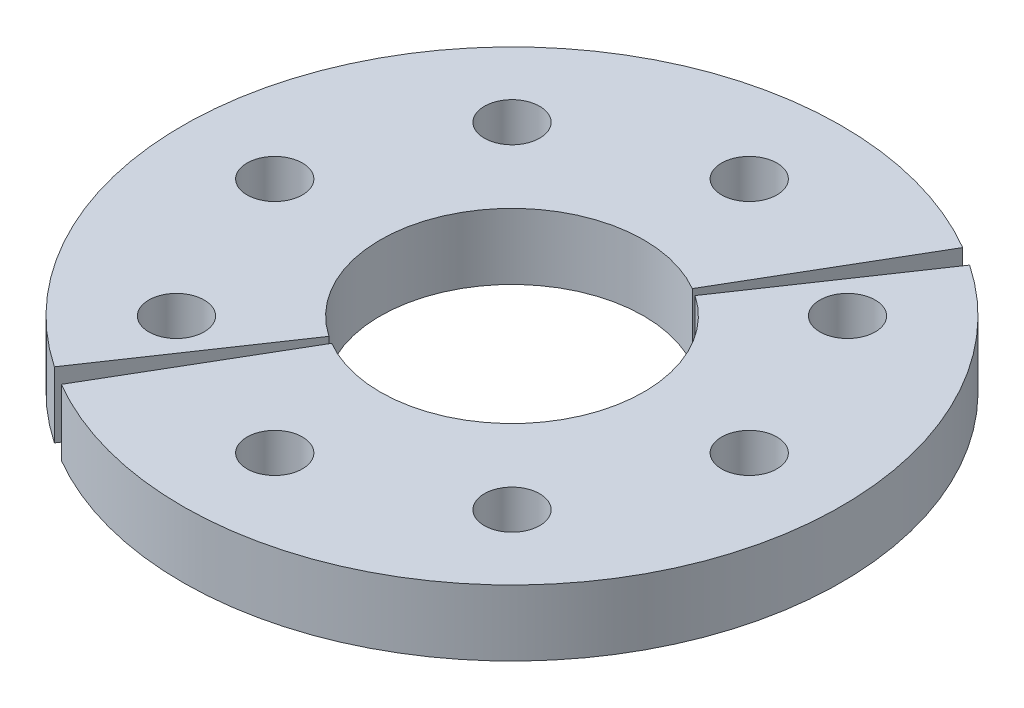
ISO-10303-21;
HEADER;
FILE_DESCRIPTION(('STEP AP214'),'2;1');
FILE_NAME('part.step','',(''),(''),'','','');
FILE_SCHEMA(('AUTOMOTIVE_DESIGN { 1 0 10303 214 1 1 1 1 }'));
ENDSEC;
DATA;
#1=APPLICATION_CONTEXT('core data for automotive mechanical design processes');
#2=APPLICATION_PROTOCOL_DEFINITION('international standard','automotive_design',2000,#1);
#3=PRODUCT_CONTEXT('',#1,'mechanical');
#4=PRODUCT('Part','Part','',(#3));
#5=PRODUCT_RELATED_PRODUCT_CATEGORY('part','',(#4));
#6=PRODUCT_DEFINITION_FORMATION('','',#4);
#7=PRODUCT_DEFINITION_CONTEXT('part definition',#1,'design');
#8=PRODUCT_DEFINITION('design','',#6,#7);
#9=PRODUCT_DEFINITION_SHAPE('','',#8);
#10=(LENGTH_UNIT() NAMED_UNIT(*) SI_UNIT(.MILLI.,.METRE.));
#11=(NAMED_UNIT(*) PLANE_ANGLE_UNIT() SI_UNIT($,.RADIAN.));
#12=(NAMED_UNIT(*) SI_UNIT($,.STERADIAN.) SOLID_ANGLE_UNIT());
#13=UNCERTAINTY_MEASURE_WITH_UNIT(LENGTH_MEASURE(1.E-05),#10,'distance_accuracy_value','');
#14=(GEOMETRIC_REPRESENTATION_CONTEXT(3) GLOBAL_UNCERTAINTY_ASSIGNED_CONTEXT((#13)) GLOBAL_UNIT_ASSIGNED_CONTEXT((#10,
#11,#12)) REPRESENTATION_CONTEXT('',''));
#15=CARTESIAN_POINT('',(0.,0.,0.));
#16=DIRECTION('',(0.,0.,1.));
#17=DIRECTION('',(1.,0.,0.));
#18=AXIS2_PLACEMENT_3D('',#15,#16,#17);
#19=CARTESIAN_POINT('',(0.,5.,0.));
#20=DIRECTION('',(0.863656991008905,0.,0.504079955841773));
#21=DIRECTION('',(0.504079955841773,0.,-0.863656991008905));
#22=AXIS2_PLACEMENT_3D('',#19,#20,#21);
#23=PLANE('',#22);
#24=DIRECTION('',(-0.504079955841773,0.,0.863656991008905));
#25=VECTOR('',#24,1.);
#26=CARTESIAN_POINT('',(0.,0.,0.));
#27=LINE('',#26,#25);
#28=CARTESIAN_POINT('',(-5.04079955841773,0.,8.63656991008905));
#29=VERTEX_POINT('',#28);
#30=CARTESIAN_POINT('',(-12.6019988960443,0.,21.5914247752226));
#31=VERTEX_POINT('',#30);
#32=EDGE_CURVE('E145',#29,#31,#27,.T.);
#33=ORIENTED_EDGE('',*,*,#32,.T.);
#34=DIRECTION('',(0.,-1.,0.));
#35=VECTOR('',#34,1.);
#36=CARTESIAN_POINT('',(-12.6019988960443,5.,21.5914247752226));
#37=LINE('',#36,#35);
#38=CARTESIAN_POINT('',(-12.6019988960443,5.,21.5914247752226));
#39=VERTEX_POINT('',#38);
#40=EDGE_CURVE('E13',#39,#31,#37,.T.);
#41=ORIENTED_EDGE('',*,*,#40,.F.);
#42=DIRECTION('',(-0.504079955841773,0.,0.863656991008905));
#43=VECTOR('',#42,1.);
#44=CARTESIAN_POINT('',(0.,5.,0.));
#45=LINE('',#44,#43);
#46=CARTESIAN_POINT('',(-5.04079955841773,5.,8.63656991008905));
#47=VERTEX_POINT('',#46);
#48=EDGE_CURVE('E119',#47,#39,#45,.T.);
#49=ORIENTED_EDGE('',*,*,#48,.F.);
#50=DIRECTION('',(0.,-1.,0.));
#51=VECTOR('',#50,1.);
#52=CARTESIAN_POINT('',(-5.04079955841773,5.,8.63656991008905));
#53=LINE('',#52,#51);
#54=EDGE_CURVE('E86',#47,#29,#53,.T.);
#55=ORIENTED_EDGE('',*,*,#54,.T.);
#56=EDGE_LOOP('',(#33,#41,#49,#55));
#57=FACE_BOUND('',#56,.T.);
#58=ADVANCED_FACE('F69',(#57),#23,.F.);
#59=CARTESIAN_POINT('',(0.,5.,0.));
#60=DIRECTION('',(0.,-1.,0.));
#61=DIRECTION('',(0.,0.,-1.));
#62=AXIS2_PLACEMENT_3D('',#59,#60,#61);
#63=CYLINDRICAL_SURFACE('',#62,25.);
#64=CARTESIAN_POINT('',(0.,0.,0.));
#65=DIRECTION('',(0.,1.,0.));
#66=DIRECTION('',(0.,0.,1.));
#67=AXIS2_PLACEMENT_3D('',#64,#65,#66);
#68=CIRCLE('',#67,25.);
#69=CARTESIAN_POINT('',(14.0158599127635,0.,-20.7015861929899));
#70=VERTEX_POINT('',#69);
#71=EDGE_CURVE('E124',#31,#70,#68,.T.);
#72=ORIENTED_EDGE('',*,*,#71,.T.);
#73=DIRECTION('',(0.,-1.,0.));
#74=VECTOR('',#73,1.);
#75=CARTESIAN_POINT('',(14.0158599127635,5.,-20.7015861929899));
#76=LINE('',#75,#74);
#77=CARTESIAN_POINT('',(14.0158599127635,5.,-20.7015861929899));
#78=VERTEX_POINT('',#77);
#79=EDGE_CURVE('E78',#78,#70,#76,.T.);
#80=ORIENTED_EDGE('',*,*,#79,.F.);
#81=CARTESIAN_POINT('',(0.,5.,0.));
#82=DIRECTION('',(0.,1.,0.));
#83=DIRECTION('',(0.,0.,1.));
#84=AXIS2_PLACEMENT_3D('',#81,#82,#83);
#85=CIRCLE('',#84,25.);
#86=EDGE_CURVE('E111',#39,#78,#85,.T.);
#87=ORIENTED_EDGE('',*,*,#86,.F.);
#88=ORIENTED_EDGE('',*,*,#40,.T.);
#89=EDGE_LOOP('',(#72,#80,#87,#88));
#90=FACE_BOUND('',#89,.T.);
#91=ADVANCED_FACE('F123',(#90),#63,.T.);
#92=CARTESIAN_POINT('',(0.,5.,0.));
#93=DIRECTION('',(-0.828063447719594,0.,-0.560634396510542));
#94=DIRECTION('',(-0.560634396510542,0.,0.828063447719594));
#95=AXIS2_PLACEMENT_3D('',#92,#93,#94);
#96=PLANE('',#95);
#97=DIRECTION('',(0.560634396510542,0.,-0.828063447719594));
#98=VECTOR('',#97,1.);
#99=CARTESIAN_POINT('',(0.,0.,0.));
#100=LINE('',#99,#98);
#101=CARTESIAN_POINT('',(5.60634396510542,0.,-8.28063447719594));
#102=VERTEX_POINT('',#101);
#103=EDGE_CURVE('E148',#102,#70,#100,.T.);
#104=ORIENTED_EDGE('',*,*,#103,.F.);
#105=DIRECTION('',(0.,-1.,0.));
#106=VECTOR('',#105,1.);
#107=CARTESIAN_POINT('',(5.60634396510542,5.,-8.28063447719594));
#108=LINE('',#107,#106);
#109=CARTESIAN_POINT('',(5.60634396510542,5.,-8.28063447719594));
#110=VERTEX_POINT('',#109);
#111=EDGE_CURVE('E100',#110,#102,#108,.T.);
#112=ORIENTED_EDGE('',*,*,#111,.F.);
#113=DIRECTION('',(0.560634396510542,0.,-0.828063447719594));
#114=VECTOR('',#113,1.);
#115=CARTESIAN_POINT('',(0.,5.,0.));
#116=LINE('',#115,#114);
#117=EDGE_CURVE('E118',#110,#78,#116,.T.);
#118=ORIENTED_EDGE('',*,*,#117,.T.);
#119=ORIENTED_EDGE('',*,*,#79,.T.);
#120=EDGE_LOOP('',(#104,#112,#118,#119));
#121=FACE_BOUND('',#120,.T.);
#122=ADVANCED_FACE('F127',(#121),#96,.T.);
#123=CARTESIAN_POINT('',(12.7279220613578,5.,-12.7279220613579));
#124=DIRECTION('',(0.,-1.,0.));
#125=DIRECTION('',(0.,0.,-1.));
#126=AXIS2_PLACEMENT_3D('',#123,#124,#125);
#127=CYLINDRICAL_SURFACE('',#126,2.1);
#128=CARTESIAN_POINT('',(12.7279220613578,5.,-12.7279220613579));
#129=DIRECTION('',(0.,1.,0.));
#130=DIRECTION('',(0.,0.,1.));
#131=AXIS2_PLACEMENT_3D('',#128,#129,#130);
#132=CIRCLE('',#131,2.1);
#133=CARTESIAN_POINT('',(12.7279220613578,5.,-10.6279220613579));
#134=VERTEX_POINT('',#133);
#135=EDGE_CURVE('E167',#134,#134,#132,.T.);
#136=ORIENTED_EDGE('',*,*,#135,.T.);
#137=EDGE_LOOP('',(#136));
#138=FACE_BOUND('',#137,.T.);
#139=CARTESIAN_POINT('',(12.7279220613578,0.,-12.7279220613579));
#140=DIRECTION('',(0.,1.,0.));
#141=DIRECTION('',(0.,0.,1.));
#142=AXIS2_PLACEMENT_3D('',#139,#140,#141);
#143=CIRCLE('',#142,2.1);
#144=CARTESIAN_POINT('',(12.7279220613578,0.,-10.6279220613579));
#145=VERTEX_POINT('',#144);
#146=EDGE_CURVE('E142',#145,#145,#143,.T.);
#147=ORIENTED_EDGE('',*,*,#146,.F.);
#148=EDGE_LOOP('',(#147));
#149=FACE_BOUND('',#148,.T.);
#150=ADVANCED_FACE('F171',(#138,#149),#127,.F.);
#151=CARTESIAN_POINT('',(18.,5.,0.));
#152=DIRECTION('',(0.,-1.,0.));
#153=DIRECTION('',(0.,0.,-1.));
#154=AXIS2_PLACEMENT_3D('',#151,#152,#153);
#155=CYLINDRICAL_SURFACE('',#154,2.1);
#156=CARTESIAN_POINT('',(18.,5.,0.));
#157=DIRECTION('',(0.,1.,0.));
#158=DIRECTION('',(0.,0.,1.));
#159=AXIS2_PLACEMENT_3D('',#156,#157,#158);
#160=CIRCLE('',#159,2.1);
#161=CARTESIAN_POINT('',(18.,5.,2.1));
#162=VERTEX_POINT('',#161);
#163=EDGE_CURVE('E162',#162,#162,#160,.T.);
#164=ORIENTED_EDGE('',*,*,#163,.T.);
#165=EDGE_LOOP('',(#164));
#166=FACE_BOUND('',#165,.T.);
#167=CARTESIAN_POINT('',(18.,0.,0.));
#168=DIRECTION('',(0.,1.,0.));
#169=DIRECTION('',(0.,0.,1.));
#170=AXIS2_PLACEMENT_3D('',#167,#168,#169);
#171=CIRCLE('',#170,2.1);
#172=CARTESIAN_POINT('',(18.,0.,2.1));
#173=VERTEX_POINT('',#172);
#174=EDGE_CURVE('E139',#173,#173,#171,.T.);
#175=ORIENTED_EDGE('',*,*,#174,.F.);
#176=EDGE_LOOP('',(#175));
#177=FACE_BOUND('',#176,.T.);
#178=ADVANCED_FACE('F197',(#166,#177),#155,.F.);
#179=CARTESIAN_POINT('',(12.7279220613578,5.,12.7279220613579));
#180=DIRECTION('',(0.,-1.,0.));
#181=DIRECTION('',(0.,0.,-1.));
#182=AXIS2_PLACEMENT_3D('',#179,#180,#181);
#183=CYLINDRICAL_SURFACE('',#182,2.1);
#184=CARTESIAN_POINT('',(12.7279220613578,5.,12.7279220613579));
#185=DIRECTION('',(0.,1.,0.));
#186=DIRECTION('',(0.,0.,1.));
#187=AXIS2_PLACEMENT_3D('',#184,#185,#186);
#188=CIRCLE('',#187,2.1);
#189=CARTESIAN_POINT('',(12.7279220613578,5.,14.8279220613579));
#190=VERTEX_POINT('',#189);
#191=EDGE_CURVE('E157',#190,#190,#188,.T.);
#192=ORIENTED_EDGE('',*,*,#191,.T.);
#193=EDGE_LOOP('',(#192));
#194=FACE_BOUND('',#193,.T.);
#195=CARTESIAN_POINT('',(12.7279220613578,0.,12.7279220613579));
#196=DIRECTION('',(0.,1.,0.));
#197=DIRECTION('',(0.,0.,1.));
#198=AXIS2_PLACEMENT_3D('',#195,#196,#197);
#199=CIRCLE('',#198,2.1);
#200=CARTESIAN_POINT('',(12.7279220613578,0.,14.8279220613579));
#201=VERTEX_POINT('',#200);
#202=EDGE_CURVE('E136',#201,#201,#199,.T.);
#203=ORIENTED_EDGE('',*,*,#202,.F.);
#204=EDGE_LOOP('',(#203));
#205=FACE_BOUND('',#204,.T.);
#206=ADVANCED_FACE('F199',(#194,#205),#183,.F.);
#207=CARTESIAN_POINT('',(0.,5.,18.));
#208=DIRECTION('',(0.,-1.,0.));
#209=DIRECTION('',(0.,0.,-1.));
#210=AXIS2_PLACEMENT_3D('',#207,#208,#209);
#211=CYLINDRICAL_SURFACE('',#210,2.1);
#212=CARTESIAN_POINT('',(0.,5.,18.));
#213=DIRECTION('',(0.,1.,0.));
#214=DIRECTION('',(0.,0.,1.));
#215=AXIS2_PLACEMENT_3D('',#212,#213,#214);
#216=CIRCLE('',#215,2.1);
#217=CARTESIAN_POINT('',(0.,5.,20.1));
#218=VERTEX_POINT('',#217);
#219=EDGE_CURVE('E153',#218,#218,#216,.T.);
#220=ORIENTED_EDGE('',*,*,#219,.T.);
#221=EDGE_LOOP('',(#220));
#222=FACE_BOUND('',#221,.T.);
#223=CARTESIAN_POINT('',(0.,0.,18.));
#224=DIRECTION('',(0.,1.,0.));
#225=DIRECTION('',(0.,0.,1.));
#226=AXIS2_PLACEMENT_3D('',#223,#224,#225);
#227=CIRCLE('',#226,2.1);
#228=CARTESIAN_POINT('',(0.,0.,20.1));
#229=VERTEX_POINT('',#228);
#230=EDGE_CURVE('E133',#229,#229,#227,.T.);
#231=ORIENTED_EDGE('',*,*,#230,.F.);
#232=EDGE_LOOP('',(#231));
#233=FACE_BOUND('',#232,.T.);
#234=ADVANCED_FACE('F71',(#222,#233),#211,.F.);
#235=CARTESIAN_POINT('',(0.,5.,0.));
#236=DIRECTION('',(0.,-1.,0.));
#237=DIRECTION('',(0.,0.,-1.));
#238=AXIS2_PLACEMENT_3D('',#235,#236,#237);
#239=CYLINDRICAL_SURFACE('',#238,10.);
#240=CARTESIAN_POINT('',(0.,0.,0.));
#241=DIRECTION('',(0.,1.,0.));
#242=DIRECTION('',(0.,0.,1.));
#243=AXIS2_PLACEMENT_3D('',#240,#241,#242);
#244=CIRCLE('',#243,10.);
#245=EDGE_CURVE('E150',#29,#102,#244,.T.);
#246=ORIENTED_EDGE('',*,*,#245,.F.);
#247=ORIENTED_EDGE('',*,*,#54,.F.);
#248=CARTESIAN_POINT('',(0.,5.,0.));
#249=DIRECTION('',(0.,1.,0.));
#250=DIRECTION('',(0.,0.,1.));
#251=AXIS2_PLACEMENT_3D('',#248,#249,#250);
#252=CIRCLE('',#251,10.);
#253=EDGE_CURVE('E128',#47,#110,#252,.T.);
#254=ORIENTED_EDGE('',*,*,#253,.T.);
#255=ORIENTED_EDGE('',*,*,#111,.T.);
#256=EDGE_LOOP('',(#246,#247,#254,#255));
#257=FACE_BOUND('',#256,.T.);
#258=ADVANCED_FACE('F176',(#257),#239,.F.);
#259=CARTESIAN_POINT('',(0.,5.,0.));
#260=DIRECTION('',(0.,1.,0.));
#261=DIRECTION('',(0.,0.,1.));
#262=AXIS2_PLACEMENT_3D('',#259,#260,#261);
#263=PLANE('',#262);
#264=ORIENTED_EDGE('',*,*,#219,.F.);
#265=EDGE_LOOP('',(#264));
#266=FACE_BOUND('',#265,.T.);
#267=ORIENTED_EDGE('',*,*,#191,.F.);
#268=EDGE_LOOP('',(#267));
#269=FACE_BOUND('',#268,.T.);
#270=ORIENTED_EDGE('',*,*,#163,.F.);
#271=EDGE_LOOP('',(#270));
#272=FACE_BOUND('',#271,.T.);
#273=ORIENTED_EDGE('',*,*,#135,.F.);
#274=EDGE_LOOP('',(#273));
#275=FACE_BOUND('',#274,.T.);
#276=ORIENTED_EDGE('',*,*,#48,.T.);
#277=ORIENTED_EDGE('',*,*,#86,.T.);
#278=ORIENTED_EDGE('',*,*,#117,.F.);
#279=ORIENTED_EDGE('',*,*,#253,.F.);
#280=EDGE_LOOP('',(#276,#277,#278,#279));
#281=FACE_BOUND('',#280,.T.);
#282=ADVANCED_FACE('F115',(#266,#269,#272,#275,#281),#263,.T.);
#283=CARTESIAN_POINT('',(0.,0.,0.));
#284=DIRECTION('',(0.,1.,0.));
#285=DIRECTION('',(0.,0.,1.));
#286=AXIS2_PLACEMENT_3D('',#283,#284,#285);
#287=PLANE('',#286);
#288=ORIENTED_EDGE('',*,*,#230,.T.);
#289=EDGE_LOOP('',(#288));
#290=FACE_BOUND('',#289,.T.);
#291=ORIENTED_EDGE('',*,*,#202,.T.);
#292=EDGE_LOOP('',(#291));
#293=FACE_BOUND('',#292,.T.);
#294=ORIENTED_EDGE('',*,*,#174,.T.);
#295=EDGE_LOOP('',(#294));
#296=FACE_BOUND('',#295,.T.);
#297=ORIENTED_EDGE('',*,*,#146,.T.);
#298=EDGE_LOOP('',(#297));
#299=FACE_BOUND('',#298,.T.);
#300=ORIENTED_EDGE('',*,*,#32,.F.);
#301=ORIENTED_EDGE('',*,*,#245,.T.);
#302=ORIENTED_EDGE('',*,*,#103,.T.);
#303=ORIENTED_EDGE('',*,*,#71,.F.);
#304=EDGE_LOOP('',(#300,#301,#302,#303));
#305=FACE_BOUND('',#304,.T.);
#306=ADVANCED_FACE('F175',(#290,#293,#296,#299,#305),#287,.F.);
#307=CLOSED_SHELL('',(#58,#91,#122,#150,#178,#206,#234,#258,#282,#306));
#308=MANIFOLD_SOLID_BREP('B2',#307);
#309=CARTESIAN_POINT('',(0.,5.,0.));
#310=DIRECTION('',(-0.863656991008905,0.,-0.504079955841774));
#311=DIRECTION('',(-0.504079955841774,0.,0.863656991008905));
#312=AXIS2_PLACEMENT_3D('',#309,#310,#311);
#313=PLANE('',#312);
#314=DIRECTION('',(0.504079955841774,0.,-0.863656991008905));
#315=VECTOR('',#314,1.);
#316=CARTESIAN_POINT('',(0.,0.,0.));
#317=LINE('',#316,#315);
#318=CARTESIAN_POINT('',(5.04079955841774,0.,-8.63656991008905));
#319=VERTEX_POINT('',#318);
#320=CARTESIAN_POINT('',(12.6019988960443,0.,-21.5914247752226));
#321=VERTEX_POINT('',#320);
#322=EDGE_CURVE('E353',#319,#321,#317,.T.);
#323=ORIENTED_EDGE('',*,*,#322,.T.);
#324=DIRECTION('',(0.,-1.,0.));
#325=VECTOR('',#324,1.);
#326=CARTESIAN_POINT('',(12.6019988960443,5.,-21.5914247752226));
#327=LINE('',#326,#325);
#328=CARTESIAN_POINT('',(12.6019988960443,5.,-21.5914247752226));
#329=VERTEX_POINT('',#328);
#330=EDGE_CURVE('E67',#329,#321,#327,.T.);
#331=ORIENTED_EDGE('',*,*,#330,.F.);
#332=DIRECTION('',(0.504079955841774,0.,-0.863656991008905));
#333=VECTOR('',#332,1.);
#334=CARTESIAN_POINT('',(0.,5.,0.));
#335=LINE('',#334,#333);
#336=CARTESIAN_POINT('',(5.04079955841774,5.,-8.63656991008905));
#337=VERTEX_POINT('',#336);
#338=EDGE_CURVE('E327',#337,#329,#335,.T.);
#339=ORIENTED_EDGE('',*,*,#338,.F.);
#340=DIRECTION('',(0.,-1.,0.));
#341=VECTOR('',#340,1.);
#342=CARTESIAN_POINT('',(5.04079955841774,5.,-8.63656991008905));
#343=LINE('',#342,#341);
#344=EDGE_CURVE('E294',#337,#319,#343,.T.);
#345=ORIENTED_EDGE('',*,*,#344,.T.);
#346=EDGE_LOOP('',(#323,#331,#339,#345));
#347=FACE_BOUND('',#346,.T.);
#348=ADVANCED_FACE('F277',(#347),#313,.F.);
#349=CARTESIAN_POINT('',(0.,5.,0.));
#350=DIRECTION('',(0.,-1.,0.));
#351=DIRECTION('',(0.,0.,-1.));
#352=AXIS2_PLACEMENT_3D('',#349,#350,#351);
#353=CYLINDRICAL_SURFACE('',#352,25.);
#354=CARTESIAN_POINT('',(0.,0.,0.));
#355=DIRECTION('',(0.,1.,0.));
#356=DIRECTION('',(0.,0.,1.));
#357=AXIS2_PLACEMENT_3D('',#354,#355,#356);
#358=CIRCLE('',#357,25.);
#359=CARTESIAN_POINT('',(-14.0158599127635,0.,20.7015861929899));
#360=VERTEX_POINT('',#359);
#361=EDGE_CURVE('E332',#321,#360,#358,.T.);
#362=ORIENTED_EDGE('',*,*,#361,.T.);
#363=DIRECTION('',(0.,-1.,0.));
#364=VECTOR('',#363,1.);
#365=CARTESIAN_POINT('',(-14.0158599127635,5.,20.7015861929899));
#366=LINE('',#365,#364);
#367=CARTESIAN_POINT('',(-14.0158599127635,5.,20.7015861929899));
#368=VERTEX_POINT('',#367);
#369=EDGE_CURVE('E286',#368,#360,#366,.T.);
#370=ORIENTED_EDGE('',*,*,#369,.F.);
#371=CARTESIAN_POINT('',(0.,5.,0.));
#372=DIRECTION('',(0.,1.,0.));
#373=DIRECTION('',(0.,0.,1.));
#374=AXIS2_PLACEMENT_3D('',#371,#372,#373);
#375=CIRCLE('',#374,25.);
#376=EDGE_CURVE('E319',#329,#368,#375,.T.);
#377=ORIENTED_EDGE('',*,*,#376,.F.);
#378=ORIENTED_EDGE('',*,*,#330,.T.);
#379=EDGE_LOOP('',(#362,#370,#377,#378));
#380=FACE_BOUND('',#379,.T.);
#381=ADVANCED_FACE('F331',(#380),#353,.T.);
#382=CARTESIAN_POINT('',(0.,5.,0.));
#383=DIRECTION('',(0.828063447719594,0.,0.560634396510542));
#384=DIRECTION('',(0.560634396510542,0.,-0.828063447719594));
#385=AXIS2_PLACEMENT_3D('',#382,#383,#384);
#386=PLANE('',#385);
#387=DIRECTION('',(-0.560634396510542,0.,0.828063447719594));
#388=VECTOR('',#387,1.);
#389=CARTESIAN_POINT('',(0.,0.,0.));
#390=LINE('',#389,#388);
#391=CARTESIAN_POINT('',(-5.60634396510542,0.,8.28063447719594));
#392=VERTEX_POINT('',#391);
#393=EDGE_CURVE('E356',#392,#360,#390,.T.);
#394=ORIENTED_EDGE('',*,*,#393,.F.);
#395=DIRECTION('',(0.,-1.,0.));
#396=VECTOR('',#395,1.);
#397=CARTESIAN_POINT('',(-5.60634396510542,5.,8.28063447719594));
#398=LINE('',#397,#396);
#399=CARTESIAN_POINT('',(-5.60634396510542,5.,8.28063447719594));
#400=VERTEX_POINT('',#399);
#401=EDGE_CURVE('E308',#400,#392,#398,.T.);
#402=ORIENTED_EDGE('',*,*,#401,.F.);
#403=DIRECTION('',(-0.560634396510542,0.,0.828063447719594));
#404=VECTOR('',#403,1.);
#405=CARTESIAN_POINT('',(0.,5.,0.));
#406=LINE('',#405,#404);
#407=EDGE_CURVE('E326',#400,#368,#406,.T.);
#408=ORIENTED_EDGE('',*,*,#407,.T.);
#409=ORIENTED_EDGE('',*,*,#369,.T.);
#410=EDGE_LOOP('',(#394,#402,#408,#409));
#411=FACE_BOUND('',#410,.T.);
#412=ADVANCED_FACE('F335',(#411),#386,.T.);
#413=CARTESIAN_POINT('',(-18.,5.,0.));
#414=DIRECTION('',(0.,-1.,0.));
#415=DIRECTION('',(0.,0.,-1.));
#416=AXIS2_PLACEMENT_3D('',#413,#414,#415);
#417=CYLINDRICAL_SURFACE('',#416,2.1);
#418=CARTESIAN_POINT('',(-18.,5.,0.));
#419=DIRECTION('',(0.,1.,0.));
#420=DIRECTION('',(0.,0.,1.));
#421=AXIS2_PLACEMENT_3D('',#418,#419,#420);
#422=CIRCLE('',#421,2.1);
#423=CARTESIAN_POINT('',(-18.,5.,2.1));
#424=VERTEX_POINT('',#423);
#425=EDGE_CURVE('E375',#424,#424,#422,.T.);
#426=ORIENTED_EDGE('',*,*,#425,.T.);
#427=EDGE_LOOP('',(#426));
#428=FACE_BOUND('',#427,.T.);
#429=CARTESIAN_POINT('',(-18.,0.,0.));
#430=DIRECTION('',(0.,1.,0.));
#431=DIRECTION('',(0.,0.,1.));
#432=AXIS2_PLACEMENT_3D('',#429,#430,#431);
#433=CIRCLE('',#432,2.1);
#434=CARTESIAN_POINT('',(-18.,0.,2.1));
#435=VERTEX_POINT('',#434);
#436=EDGE_CURVE('E350',#435,#435,#433,.T.);
#437=ORIENTED_EDGE('',*,*,#436,.F.);
#438=EDGE_LOOP('',(#437));
#439=FACE_BOUND('',#438,.T.);
#440=ADVANCED_FACE('F379',(#428,#439),#417,.F.);
#441=CARTESIAN_POINT('',(-12.7279220613579,5.,-12.7279220613578));
#442=DIRECTION('',(0.,-1.,0.));
#443=DIRECTION('',(0.,0.,-1.));
#444=AXIS2_PLACEMENT_3D('',#441,#442,#443);
#445=CYLINDRICAL_SURFACE('',#444,2.1);
#446=CARTESIAN_POINT('',(-12.7279220613579,5.,-12.7279220613578));
#447=DIRECTION('',(0.,1.,0.));
#448=DIRECTION('',(0.,0.,1.));
#449=AXIS2_PLACEMENT_3D('',#446,#447,#448);
#450=CIRCLE('',#449,2.1);
#451=CARTESIAN_POINT('',(-12.7279220613579,5.,-10.6279220613578));
#452=VERTEX_POINT('',#451);
#453=EDGE_CURVE('E370',#452,#452,#450,.T.);
#454=ORIENTED_EDGE('',*,*,#453,.T.);
#455=EDGE_LOOP('',(#454));
#456=FACE_BOUND('',#455,.T.);
#457=CARTESIAN_POINT('',(-12.7279220613579,0.,-12.7279220613578));
#458=DIRECTION('',(0.,1.,0.));
#459=DIRECTION('',(0.,0.,1.));
#460=AXIS2_PLACEMENT_3D('',#457,#458,#459);
#461=CIRCLE('',#460,2.1);
#462=CARTESIAN_POINT('',(-12.7279220613579,0.,-10.6279220613578));
#463=VERTEX_POINT('',#462);
#464=EDGE_CURVE('E347',#463,#463,#461,.T.);
#465=ORIENTED_EDGE('',*,*,#464,.F.);
#466=EDGE_LOOP('',(#465));
#467=FACE_BOUND('',#466,.T.);
#468=ADVANCED_FACE('F405',(#456,#467),#445,.F.);
#469=CARTESIAN_POINT('',(0.,5.,-18.));
#470=DIRECTION('',(0.,-1.,0.));
#471=DIRECTION('',(0.,0.,-1.));
#472=AXIS2_PLACEMENT_3D('',#469,#470,#471);
#473=CYLINDRICAL_SURFACE('',#472,2.1);
#474=CARTESIAN_POINT('',(0.,5.,-18.));
#475=DIRECTION('',(0.,1.,0.));
#476=DIRECTION('',(0.,0.,1.));
#477=AXIS2_PLACEMENT_3D('',#474,#475,#476);
#478=CIRCLE('',#477,2.1);
#479=CARTESIAN_POINT('',(0.,5.,-15.9));
#480=VERTEX_POINT('',#479);
#481=EDGE_CURVE('E365',#480,#480,#478,.T.);
#482=ORIENTED_EDGE('',*,*,#481,.T.);
#483=EDGE_LOOP('',(#482));
#484=FACE_BOUND('',#483,.T.);
#485=CARTESIAN_POINT('',(0.,0.,-18.));
#486=DIRECTION('',(0.,1.,0.));
#487=DIRECTION('',(0.,0.,1.));
#488=AXIS2_PLACEMENT_3D('',#485,#486,#487);
#489=CIRCLE('',#488,2.1);
#490=CARTESIAN_POINT('',(0.,0.,-15.9));
#491=VERTEX_POINT('',#490);
#492=EDGE_CURVE('E344',#491,#491,#489,.T.);
#493=ORIENTED_EDGE('',*,*,#492,.F.);
#494=EDGE_LOOP('',(#493));
#495=FACE_BOUND('',#494,.T.);
#496=ADVANCED_FACE('F407',(#484,#495),#473,.F.);
#497=CARTESIAN_POINT('',(-12.7279220613579,5.,12.7279220613578));
#498=DIRECTION('',(0.,-1.,0.));
#499=DIRECTION('',(0.,0.,-1.));
#500=AXIS2_PLACEMENT_3D('',#497,#498,#499);
#501=CYLINDRICAL_SURFACE('',#500,2.1);
#502=CARTESIAN_POINT('',(-12.7279220613579,5.,12.7279220613578));
#503=DIRECTION('',(0.,1.,0.));
#504=DIRECTION('',(0.,0.,1.));
#505=AXIS2_PLACEMENT_3D('',#502,#503,#504);
#506=CIRCLE('',#505,2.1);
#507=CARTESIAN_POINT('',(-12.7279220613579,5.,14.8279220613578));
#508=VERTEX_POINT('',#507);
#509=EDGE_CURVE('E361',#508,#508,#506,.T.);
#510=ORIENTED_EDGE('',*,*,#509,.T.);
#511=EDGE_LOOP('',(#510));
#512=FACE_BOUND('',#511,.T.);
#513=CARTESIAN_POINT('',(-12.7279220613579,0.,12.7279220613578));
#514=DIRECTION('',(0.,1.,0.));
#515=DIRECTION('',(0.,0.,1.));
#516=AXIS2_PLACEMENT_3D('',#513,#514,#515);
#517=CIRCLE('',#516,2.1);
#518=CARTESIAN_POINT('',(-12.7279220613579,0.,14.8279220613578));
#519=VERTEX_POINT('',#518);
#520=EDGE_CURVE('E341',#519,#519,#517,.T.);
#521=ORIENTED_EDGE('',*,*,#520,.F.);
#522=EDGE_LOOP('',(#521));
#523=FACE_BOUND('',#522,.T.);
#524=ADVANCED_FACE('F279',(#512,#523),#501,.F.);
#525=CARTESIAN_POINT('',(0.,5.,0.));
#526=DIRECTION('',(0.,-1.,0.));
#527=DIRECTION('',(0.,0.,-1.));
#528=AXIS2_PLACEMENT_3D('',#525,#526,#527);
#529=CYLINDRICAL_SURFACE('',#528,10.);
#530=CARTESIAN_POINT('',(0.,0.,0.));
#531=DIRECTION('',(0.,1.,0.));
#532=DIRECTION('',(0.,0.,1.));
#533=AXIS2_PLACEMENT_3D('',#530,#531,#532);
#534=CIRCLE('',#533,10.);
#535=EDGE_CURVE('E358',#319,#392,#534,.T.);
#536=ORIENTED_EDGE('',*,*,#535,.F.);
#537=ORIENTED_EDGE('',*,*,#344,.F.);
#538=CARTESIAN_POINT('',(0.,5.,0.));
#539=DIRECTION('',(0.,1.,0.));
#540=DIRECTION('',(0.,0.,1.));
#541=AXIS2_PLACEMENT_3D('',#538,#539,#540);
#542=CIRCLE('',#541,10.);
#543=EDGE_CURVE('E336',#337,#400,#542,.T.);
#544=ORIENTED_EDGE('',*,*,#543,.T.);
#545=ORIENTED_EDGE('',*,*,#401,.T.);
#546=EDGE_LOOP('',(#536,#537,#544,#545));
#547=FACE_BOUND('',#546,.T.);
#548=ADVANCED_FACE('F384',(#547),#529,.F.);
#549=CARTESIAN_POINT('',(0.,5.,0.));
#550=DIRECTION('',(0.,1.,0.));
#551=DIRECTION('',(0.,0.,1.));
#552=AXIS2_PLACEMENT_3D('',#549,#550,#551);
#553=PLANE('',#552);
#554=ORIENTED_EDGE('',*,*,#509,.F.);
#555=EDGE_LOOP('',(#554));
#556=FACE_BOUND('',#555,.T.);
#557=ORIENTED_EDGE('',*,*,#481,.F.);
#558=EDGE_LOOP('',(#557));
#559=FACE_BOUND('',#558,.T.);
#560=ORIENTED_EDGE('',*,*,#453,.F.);
#561=EDGE_LOOP('',(#560));
#562=FACE_BOUND('',#561,.T.);
#563=ORIENTED_EDGE('',*,*,#425,.F.);
#564=EDGE_LOOP('',(#563));
#565=FACE_BOUND('',#564,.T.);
#566=ORIENTED_EDGE('',*,*,#338,.T.);
#567=ORIENTED_EDGE('',*,*,#376,.T.);
#568=ORIENTED_EDGE('',*,*,#407,.F.);
#569=ORIENTED_EDGE('',*,*,#543,.F.);
#570=EDGE_LOOP('',(#566,#567,#568,#569));
#571=FACE_BOUND('',#570,.T.);
#572=ADVANCED_FACE('F323',(#556,#559,#562,#565,#571),#553,.T.);
#573=CARTESIAN_POINT('',(0.,0.,0.));
#574=DIRECTION('',(0.,1.,0.));
#575=DIRECTION('',(0.,0.,1.));
#576=AXIS2_PLACEMENT_3D('',#573,#574,#575);
#577=PLANE('',#576);
#578=ORIENTED_EDGE('',*,*,#520,.T.);
#579=EDGE_LOOP('',(#578));
#580=FACE_BOUND('',#579,.T.);
#581=ORIENTED_EDGE('',*,*,#492,.T.);
#582=EDGE_LOOP('',(#581));
#583=FACE_BOUND('',#582,.T.);
#584=ORIENTED_EDGE('',*,*,#464,.T.);
#585=EDGE_LOOP('',(#584));
#586=FACE_BOUND('',#585,.T.);
#587=ORIENTED_EDGE('',*,*,#436,.T.);
#588=EDGE_LOOP('',(#587));
#589=FACE_BOUND('',#588,.T.);
#590=ORIENTED_EDGE('',*,*,#322,.F.);
#591=ORIENTED_EDGE('',*,*,#535,.T.);
#592=ORIENTED_EDGE('',*,*,#393,.T.);
#593=ORIENTED_EDGE('',*,*,#361,.F.);
#594=EDGE_LOOP('',(#590,#591,#592,#593));
#595=FACE_BOUND('',#594,.T.);
#596=ADVANCED_FACE('F383',(#580,#583,#586,#589,#595),#577,.F.);
#597=CLOSED_SHELL('',(#348,#381,#412,#440,#468,#496,#524,#548,#572,#596));
#598=MANIFOLD_SOLID_BREP('B7',#597);
#599=ADVANCED_BREP_SHAPE_REPRESENTATION('',(#18,#308,#598),#14);
#600=SHAPE_DEFINITION_REPRESENTATION(#9,#599);
ENDSEC;
END-ISO-10303-21;
